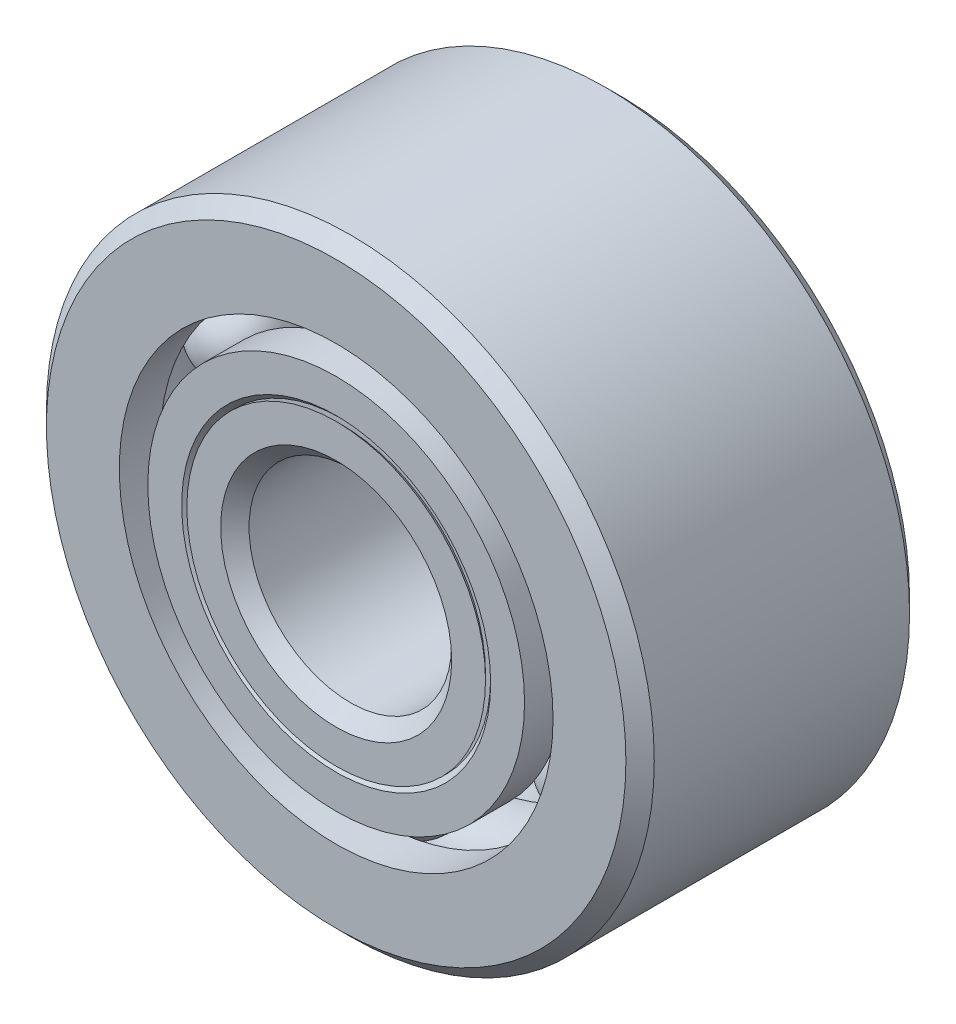
ISO-10303-21;
HEADER;
FILE_DESCRIPTION(('STEP AP214'),'2;1');
FILE_NAME('part.step','',(''),(''),'','','');
FILE_SCHEMA(('AUTOMOTIVE_DESIGN { 1 0 10303 214 1 1 1 1 }'));
ENDSEC;
DATA;
#1=APPLICATION_CONTEXT('core data for automotive mechanical design processes');
#2=APPLICATION_PROTOCOL_DEFINITION('international standard','automotive_design',2000,#1);
#3=PRODUCT_CONTEXT('',#1,'mechanical');
#4=PRODUCT('Part','Part','',(#3));
#5=PRODUCT_RELATED_PRODUCT_CATEGORY('part','',(#4));
#6=PRODUCT_DEFINITION_FORMATION('','',#4);
#7=PRODUCT_DEFINITION_CONTEXT('part definition',#1,'design');
#8=PRODUCT_DEFINITION('design','',#6,#7);
#9=PRODUCT_DEFINITION_SHAPE('','',#8);
#10=(LENGTH_UNIT() NAMED_UNIT(*) SI_UNIT(.MILLI.,.METRE.));
#11=(NAMED_UNIT(*) PLANE_ANGLE_UNIT() SI_UNIT($,.RADIAN.));
#12=(NAMED_UNIT(*) SI_UNIT($,.STERADIAN.) SOLID_ANGLE_UNIT());
#13=UNCERTAINTY_MEASURE_WITH_UNIT(LENGTH_MEASURE(1.E-05),#10,'distance_accuracy_value','');
#14=(GEOMETRIC_REPRESENTATION_CONTEXT(3) GLOBAL_UNCERTAINTY_ASSIGNED_CONTEXT((#13)) GLOBAL_UNIT_ASSIGNED_CONTEXT((#10,
#11,#12)) REPRESENTATION_CONTEXT('',''));
#15=CARTESIAN_POINT('',(0.,0.,0.));
#16=DIRECTION('',(0.,0.,1.));
#17=DIRECTION('',(1.,0.,0.));
#18=AXIS2_PLACEMENT_3D('',#15,#16,#17);
#19=CARTESIAN_POINT('',(-8.66025403784433,5.0000000000001,-3.));
#20=DIRECTION('',(0.,0.,1.));
#21=DIRECTION('',(-0.866025403784433,0.50000000000001,0.));
#22=AXIS2_PLACEMENT_3D('',#19,#20,#21);
#23=SPHERICAL_SURFACE('',#22,2.12005336085392);
#24=CARTESIAN_POINT('',(-8.66025403784433,5.0000000000001,-0.879946639146077));
#25=VERTEX_POINT('',#24);
#26=VERTEX_LOOP('',#25);
#27=FACE_BOUND('',#26,.T.);
#28=ADVANCED_FACE('F40',(#27),#23,.T.);
#29=CLOSED_SHELL('',(#28));
#30=MANIFOLD_SOLID_BREP('B2',#29);
#31=CARTESIAN_POINT('',(-8.66025403784443,-4.99999999999992,-3.));
#32=DIRECTION('',(0.,0.,1.));
#33=DIRECTION('',(-0.866025403784443,-0.499999999999992,0.));
#34=AXIS2_PLACEMENT_3D('',#31,#32,#33);
#35=SPHERICAL_SURFACE('',#34,2.12005336085392);
#36=CARTESIAN_POINT('',(-8.66025403784443,-4.99999999999992,-0.879946639146077));
#37=VERTEX_POINT('',#36);
#38=VERTEX_LOOP('',#37);
#39=FACE_BOUND('',#38,.T.);
#40=ADVANCED_FACE('F59',(#39),#35,.T.);
#41=CLOSED_SHELL('',(#40));
#42=MANIFOLD_SOLID_BREP('B6',#41);
#43=CARTESIAN_POINT('',(0.,-10.,-3.));
#44=DIRECTION('',(0.,0.,1.));
#45=DIRECTION('',(0.,-1.,0.));
#46=AXIS2_PLACEMENT_3D('',#43,#44,#45);
#47=SPHERICAL_SURFACE('',#46,2.12005336085392);
#48=CARTESIAN_POINT('',(0.,-10.,-0.879946639146077));
#49=VERTEX_POINT('',#48);
#50=VERTEX_LOOP('',#49);
#51=FACE_BOUND('',#50,.T.);
#52=ADVANCED_FACE('F78',(#51),#47,.T.);
#53=CLOSED_SHELL('',(#52));
#54=MANIFOLD_SOLID_BREP('B36',#53);
#55=CARTESIAN_POINT('',(8.66025403784437,-5.00000000000004,-3.));
#56=DIRECTION('',(0.,0.,1.));
#57=DIRECTION('',(0.866025403784436,-0.500000000000004,0.));
#58=AXIS2_PLACEMENT_3D('',#55,#56,#57);
#59=SPHERICAL_SURFACE('',#58,2.12005336085392);
#60=CARTESIAN_POINT('',(8.66025403784437,-5.00000000000004,-0.879946639146077));
#61=VERTEX_POINT('',#60);
#62=VERTEX_LOOP('',#61);
#63=FACE_BOUND('',#62,.T.);
#64=ADVANCED_FACE('F97',(#63),#59,.T.);
#65=CLOSED_SHELL('',(#64));
#66=MANIFOLD_SOLID_BREP('B55',#65);
#67=CARTESIAN_POINT('',(8.6602540378444,4.99999999999998,-3.));
#68=DIRECTION('',(0.,0.,1.));
#69=DIRECTION('',(0.86602540378444,0.499999999999998,0.));
#70=AXIS2_PLACEMENT_3D('',#67,#68,#69);
#71=SPHERICAL_SURFACE('',#70,2.12005336085392);
#72=CARTESIAN_POINT('',(8.6602540378444,4.99999999999998,-0.879946639146077));
#73=VERTEX_POINT('',#72);
#74=VERTEX_LOOP('',#73);
#75=FACE_BOUND('',#74,.T.);
#76=ADVANCED_FACE('F116',(#75),#71,.T.);
#77=CLOSED_SHELL('',(#76));
#78=MANIFOLD_SOLID_BREP('B74',#77);
#79=CARTESIAN_POINT('',(-8.66025403784433,5.0000000000001,3.));
#80=DIRECTION('',(0.,0.,1.));
#81=DIRECTION('',(-0.866025403784433,0.50000000000001,0.));
#82=AXIS2_PLACEMENT_3D('',#79,#80,#81);
#83=SPHERICAL_SURFACE('',#82,2.12005336085392);
#84=CARTESIAN_POINT('',(-8.66025403784433,5.0000000000001,5.12005336085392));
#85=VERTEX_POINT('',#84);
#86=VERTEX_LOOP('',#85);
#87=FACE_BOUND('',#86,.T.);
#88=ADVANCED_FACE('F135',(#87),#83,.T.);
#89=CLOSED_SHELL('',(#88));
#90=MANIFOLD_SOLID_BREP('B93',#89);
#91=CARTESIAN_POINT('',(-8.66025403784444,-4.99999999999992,3.));
#92=DIRECTION('',(0.,0.,1.));
#93=DIRECTION('',(-0.866025403784443,-0.499999999999992,0.));
#94=AXIS2_PLACEMENT_3D('',#91,#92,#93);
#95=SPHERICAL_SURFACE('',#94,2.12005336085392);
#96=CARTESIAN_POINT('',(-8.66025403784444,-4.99999999999992,5.12005336085392));
#97=VERTEX_POINT('',#96);
#98=VERTEX_LOOP('',#97);
#99=FACE_BOUND('',#98,.T.);
#100=ADVANCED_FACE('F154',(#99),#95,.T.);
#101=CLOSED_SHELL('',(#100));
#102=MANIFOLD_SOLID_BREP('B112',#101);
#103=CARTESIAN_POINT('',(0.,-10.,3.));
#104=DIRECTION('',(0.,0.,1.));
#105=DIRECTION('',(0.,-1.,0.));
#106=AXIS2_PLACEMENT_3D('',#103,#104,#105);
#107=SPHERICAL_SURFACE('',#106,2.12005336085392);
#108=CARTESIAN_POINT('',(0.,-10.,5.12005336085392));
#109=VERTEX_POINT('',#108);
#110=VERTEX_LOOP('',#109);
#111=FACE_BOUND('',#110,.T.);
#112=ADVANCED_FACE('F173',(#111),#107,.T.);
#113=CLOSED_SHELL('',(#112));
#114=MANIFOLD_SOLID_BREP('B131',#113);
#115=CARTESIAN_POINT('',(8.66025403784437,-5.00000000000004,3.));
#116=DIRECTION('',(0.,0.,1.));
#117=DIRECTION('',(0.866025403784436,-0.500000000000004,0.));
#118=AXIS2_PLACEMENT_3D('',#115,#116,#117);
#119=SPHERICAL_SURFACE('',#118,2.12005336085392);
#120=CARTESIAN_POINT('',(8.66025403784437,-5.00000000000004,5.12005336085392));
#121=VERTEX_POINT('',#120);
#122=VERTEX_LOOP('',#121);
#123=FACE_BOUND('',#122,.T.);
#124=ADVANCED_FACE('F192',(#123),#119,.T.);
#125=CLOSED_SHELL('',(#124));
#126=MANIFOLD_SOLID_BREP('B150',#125);
#127=CARTESIAN_POINT('',(8.6602540378444,4.99999999999998,3.));
#128=DIRECTION('',(0.,0.,1.));
#129=DIRECTION('',(0.86602540378444,0.499999999999998,0.));
#130=AXIS2_PLACEMENT_3D('',#127,#128,#129);
#131=SPHERICAL_SURFACE('',#130,2.12005336085392);
#132=CARTESIAN_POINT('',(8.6602540378444,4.99999999999998,5.12005336085392));
#133=VERTEX_POINT('',#132);
#134=VERTEX_LOOP('',#133);
#135=FACE_BOUND('',#134,.T.);
#136=ADVANCED_FACE('F211',(#135),#131,.T.);
#137=CLOSED_SHELL('',(#136));
#138=MANIFOLD_SOLID_BREP('B169',#137);
#139=CARTESIAN_POINT('',(0.,10.,-3.));
#140=DIRECTION('',(0.,0.,1.));
#141=DIRECTION('',(0.,1.,0.));
#142=AXIS2_PLACEMENT_3D('',#139,#140,#141);
#143=SPHERICAL_SURFACE('',#142,2.12005336085392);
#144=CARTESIAN_POINT('',(0.,10.,-0.879946639146077));
#145=VERTEX_POINT('',#144);
#146=VERTEX_LOOP('',#145);
#147=FACE_BOUND('',#146,.T.);
#148=ADVANCED_FACE('F230',(#147),#143,.T.);
#149=CLOSED_SHELL('',(#148));
#150=MANIFOLD_SOLID_BREP('B188',#149);
#151=CARTESIAN_POINT('',(0.,10.,3.));
#152=DIRECTION('',(0.,0.,1.));
#153=DIRECTION('',(0.,1.,0.));
#154=AXIS2_PLACEMENT_3D('',#151,#152,#153);
#155=SPHERICAL_SURFACE('',#154,2.12005336085392);
#156=CARTESIAN_POINT('',(0.,10.,5.12005336085392));
#157=VERTEX_POINT('',#156);
#158=VERTEX_LOOP('',#157);
#159=FACE_BOUND('',#158,.T.);
#160=ADVANCED_FACE('F251',(#159),#155,.T.);
#161=CLOSED_SHELL('',(#160));
#162=MANIFOLD_SOLID_BREP('B207',#161);
#163=CARTESIAN_POINT('',(0.,9.2967032967033,7.));
#164=DIRECTION('',(0.,0.,-1.));
#165=DIRECTION('',(-1.,0.,0.));
#166=AXIS2_PLACEMENT_3D('',#163,#164,#165);
#167=PLANE('',#166);
#168=CARTESIAN_POINT('',(0.,0.,7.));
#169=DIRECTION('',(0.,0.,1.));
#170=DIRECTION('',(1.,0.,0.));
#171=AXIS2_PLACEMENT_3D('',#168,#169,#170);
#172=CIRCLE('',#171,7.62535164835165);
#173=CARTESIAN_POINT('',(7.62535164835165,0.,7.));
#174=VERTEX_POINT('',#173);
#175=EDGE_CURVE('E250',#174,#174,#172,.T.);
#176=ORIENTED_EDGE('',*,*,#175,.F.);
#177=EDGE_LOOP('',(#176));
#178=FACE_BOUND('',#177,.T.);
#179=CARTESIAN_POINT('',(0.,0.,7.));
#180=DIRECTION('',(0.,0.,1.));
#181=DIRECTION('',(1.,0.,0.));
#182=AXIS2_PLACEMENT_3D('',#179,#180,#181);
#183=CIRCLE('',#182,9.2967032967033);
#184=CARTESIAN_POINT('',(9.2967032967033,0.,7.));
#185=VERTEX_POINT('',#184);
#186=EDGE_CURVE('E317',#185,#185,#183,.T.);
#187=ORIENTED_EDGE('',*,*,#186,.T.);
#188=EDGE_LOOP('',(#187));
#189=FACE_BOUND('',#188,.T.);
#190=ADVANCED_FACE('F271',(#178,#189),#167,.F.);
#191=CARTESIAN_POINT('',(0.,0.,7.));
#192=DIRECTION('',(0.,0.,1.));
#193=DIRECTION('',(1.,0.,0.));
#194=AXIS2_PLACEMENT_3D('',#191,#192,#193);
#195=CONICAL_SURFACE('',#194,7.62535164835165,0.785398163397447);
#196=CARTESIAN_POINT('',(0.,0.,6.746));
#197=DIRECTION('',(0.,0.,1.));
#198=DIRECTION('',(1.,0.,0.));
#199=AXIS2_PLACEMENT_3D('',#196,#197,#198);
#200=CIRCLE('',#199,7.37135164835165);
#201=CARTESIAN_POINT('',(7.37135164835165,0.,6.746));
#202=VERTEX_POINT('',#201);
#203=EDGE_CURVE('E277',#202,#202,#200,.T.);
#204=ORIENTED_EDGE('',*,*,#203,.F.);
#205=EDGE_LOOP('',(#204));
#206=FACE_BOUND('',#205,.T.);
#207=ORIENTED_EDGE('',*,*,#175,.T.);
#208=EDGE_LOOP('',(#207));
#209=FACE_BOUND('',#208,.T.);
#210=ADVANCED_FACE('F390',(#206,#209),#195,.F.);
#211=CARTESIAN_POINT('',(0.,7.11735164835165,6.746));
#212=DIRECTION('',(0.,0.,-1.));
#213=DIRECTION('',(-1.,0.,0.));
#214=AXIS2_PLACEMENT_3D('',#211,#212,#213);
#215=PLANE('',#214);
#216=CARTESIAN_POINT('',(0.,0.,6.746));
#217=DIRECTION('',(0.,0.,1.));
#218=DIRECTION('',(1.,0.,0.));
#219=AXIS2_PLACEMENT_3D('',#216,#217,#218);
#220=CIRCLE('',#219,7.11735164835165);
#221=CARTESIAN_POINT('',(7.11735164835165,0.,6.746));
#222=VERTEX_POINT('',#221);
#223=EDGE_CURVE('E281',#222,#222,#220,.T.);
#224=ORIENTED_EDGE('',*,*,#223,.F.);
#225=EDGE_LOOP('',(#224));
#226=FACE_BOUND('',#225,.T.);
#227=ORIENTED_EDGE('',*,*,#203,.T.);
#228=EDGE_LOOP('',(#227));
#229=FACE_BOUND('',#228,.T.);
#230=ADVANCED_FACE('F385',(#226,#229),#215,.F.);
#231=CARTESIAN_POINT('',(0.,0.,6.746));
#232=DIRECTION('',(0.,0.,1.));
#233=DIRECTION('',(1.,0.,0.));
#234=AXIS2_PLACEMENT_3D('',#231,#232,#233);
#235=CONICAL_SURFACE('',#234,7.11735164835165,0.785398163397442);
#236=CARTESIAN_POINT('',(0.,0.,7.));
#237=DIRECTION('',(0.,0.,1.));
#238=DIRECTION('',(1.,0.,0.));
#239=AXIS2_PLACEMENT_3D('',#236,#237,#238);
#240=CIRCLE('',#239,7.37135164835165);
#241=CARTESIAN_POINT('',(7.37135164835165,0.,7.));
#242=VERTEX_POINT('',#241);
#243=EDGE_CURVE('E285',#242,#242,#240,.T.);
#244=ORIENTED_EDGE('',*,*,#243,.F.);
#245=EDGE_LOOP('',(#244));
#246=FACE_BOUND('',#245,.T.);
#247=ORIENTED_EDGE('',*,*,#223,.T.);
#248=EDGE_LOOP('',(#247));
#249=FACE_BOUND('',#248,.T.);
#250=ADVANCED_FACE('F379',(#246,#249),#235,.T.);
#251=CARTESIAN_POINT('',(0.,7.37135164835165,7.));
#252=DIRECTION('',(0.,0.,-1.));
#253=DIRECTION('',(-1.,0.,0.));
#254=AXIS2_PLACEMENT_3D('',#251,#252,#253);
#255=PLANE('',#254);
#256=CARTESIAN_POINT('',(0.,0.,7.));
#257=DIRECTION('',(0.,0.,1.));
#258=DIRECTION('',(1.,0.,0.));
#259=AXIS2_PLACEMENT_3D('',#256,#257,#258);
#260=CIRCLE('',#259,5.7);
#261=CARTESIAN_POINT('',(5.7,0.,7.));
#262=VERTEX_POINT('',#261);
#263=EDGE_CURVE('E290',#262,#262,#260,.T.);
#264=ORIENTED_EDGE('',*,*,#263,.F.);
#265=EDGE_LOOP('',(#264));
#266=FACE_BOUND('',#265,.T.);
#267=ORIENTED_EDGE('',*,*,#243,.T.);
#268=EDGE_LOOP('',(#267));
#269=FACE_BOUND('',#268,.T.);
#270=ADVANCED_FACE('F373',(#266,#269),#255,.F.);
#271=CARTESIAN_POINT('',(0.,0.,7.));
#272=DIRECTION('',(0.,0.,1.));
#273=DIRECTION('',(1.,0.,0.));
#274=AXIS2_PLACEMENT_3D('',#271,#272,#273);
#275=CONICAL_SURFACE('',#274,5.7,0.785398163397447);
#276=CARTESIAN_POINT('',(0.,0.,6.3));
#277=DIRECTION('',(0.,0.,1.));
#278=DIRECTION('',(1.,0.,0.));
#279=AXIS2_PLACEMENT_3D('',#276,#277,#278);
#280=CIRCLE('',#279,5.);
#281=CARTESIAN_POINT('',(5.,0.,6.3));
#282=VERTEX_POINT('',#281);
#283=EDGE_CURVE('E293',#282,#282,#280,.T.);
#284=ORIENTED_EDGE('',*,*,#283,.F.);
#285=EDGE_LOOP('',(#284));
#286=FACE_BOUND('',#285,.T.);
#287=ORIENTED_EDGE('',*,*,#263,.T.);
#288=EDGE_LOOP('',(#287));
#289=FACE_BOUND('',#288,.T.);
#290=ADVANCED_FACE('F367',(#286,#289),#275,.F.);
#291=CARTESIAN_POINT('',(0.,0.,7.));
#292=DIRECTION('',(0.,0.,1.));
#293=DIRECTION('',(1.,0.,0.));
#294=AXIS2_PLACEMENT_3D('',#291,#292,#293);
#295=CYLINDRICAL_SURFACE('',#294,5.);
#296=CARTESIAN_POINT('',(0.,0.,-6.3));
#297=DIRECTION('',(0.,0.,1.));
#298=DIRECTION('',(1.,0.,0.));
#299=AXIS2_PLACEMENT_3D('',#296,#297,#298);
#300=CIRCLE('',#299,5.);
#301=CARTESIAN_POINT('',(5.,0.,-6.3));
#302=VERTEX_POINT('',#301);
#303=EDGE_CURVE('E296',#302,#302,#300,.T.);
#304=ORIENTED_EDGE('',*,*,#303,.F.);
#305=EDGE_LOOP('',(#304));
#306=FACE_BOUND('',#305,.T.);
#307=ORIENTED_EDGE('',*,*,#283,.T.);
#308=EDGE_LOOP('',(#307));
#309=FACE_BOUND('',#308,.T.);
#310=ADVANCED_FACE('F361',(#306,#309),#295,.F.);
#311=CARTESIAN_POINT('',(0.,0.,-6.3));
#312=DIRECTION('',(0.,0.,-1.));
#313=DIRECTION('',(-1.,0.,0.));
#314=AXIS2_PLACEMENT_3D('',#311,#312,#313);
#315=CONICAL_SURFACE('',#314,5.,0.785398163397446);
#316=CARTESIAN_POINT('',(0.,0.,-7.));
#317=DIRECTION('',(0.,0.,1.));
#318=DIRECTION('',(1.,0.,0.));
#319=AXIS2_PLACEMENT_3D('',#316,#317,#318);
#320=CIRCLE('',#319,5.7);
#321=CARTESIAN_POINT('',(5.7,0.,-7.));
#322=VERTEX_POINT('',#321);
#323=EDGE_CURVE('E299',#322,#322,#320,.T.);
#324=ORIENTED_EDGE('',*,*,#323,.F.);
#325=EDGE_LOOP('',(#324));
#326=FACE_BOUND('',#325,.T.);
#327=ORIENTED_EDGE('',*,*,#303,.T.);
#328=EDGE_LOOP('',(#327));
#329=FACE_BOUND('',#328,.T.);
#330=ADVANCED_FACE('F355',(#326,#329),#315,.F.);
#331=CARTESIAN_POINT('',(0.,9.2967032967033,-7.));
#332=DIRECTION('',(0.,0.,1.));
#333=DIRECTION('',(1.,0.,0.));
#334=AXIS2_PLACEMENT_3D('',#331,#332,#333);
#335=PLANE('',#334);
#336=CARTESIAN_POINT('',(0.,0.,-7.00000000000001));
#337=DIRECTION('',(0.,0.,1.));
#338=DIRECTION('',(1.,0.,0.));
#339=AXIS2_PLACEMENT_3D('',#336,#337,#338);
#340=CIRCLE('',#339,9.2967032967033);
#341=CARTESIAN_POINT('',(9.2967032967033,0.,-7.00000000000001));
#342=VERTEX_POINT('',#341);
#343=EDGE_CURVE('E302',#342,#342,#340,.T.);
#344=ORIENTED_EDGE('',*,*,#343,.F.);
#345=EDGE_LOOP('',(#344));
#346=FACE_BOUND('',#345,.T.);
#347=ORIENTED_EDGE('',*,*,#323,.T.);
#348=EDGE_LOOP('',(#347));
#349=FACE_BOUND('',#348,.T.);
#350=ADVANCED_FACE('F349',(#346,#349),#335,.F.);
#351=CARTESIAN_POINT('',(0.,0.,7.));
#352=DIRECTION('',(0.,0.,1.));
#353=DIRECTION('',(1.,0.,0.));
#354=AXIS2_PLACEMENT_3D('',#351,#352,#353);
#355=CYLINDRICAL_SURFACE('',#354,9.2967032967033);
#356=CARTESIAN_POINT('',(0.,0.,-5.));
#357=DIRECTION('',(0.,0.,1.));
#358=DIRECTION('',(1.,0.,0.));
#359=AXIS2_PLACEMENT_3D('',#356,#357,#358);
#360=CIRCLE('',#359,9.2967032967033);
#361=CARTESIAN_POINT('',(9.2967032967033,0.,-5.));
#362=VERTEX_POINT('',#361);
#363=EDGE_CURVE('E305',#362,#362,#360,.T.);
#364=ORIENTED_EDGE('',*,*,#363,.F.);
#365=EDGE_LOOP('',(#364));
#366=FACE_BOUND('',#365,.T.);
#367=ORIENTED_EDGE('',*,*,#343,.T.);
#368=EDGE_LOOP('',(#367));
#369=FACE_BOUND('',#368,.T.);
#370=ADVANCED_FACE('F343',(#366,#369),#355,.T.);
#371=CARTESIAN_POINT('',(0.,0.,-3.));
#372=DIRECTION('',(0.,0.,1.));
#373=DIRECTION('',(1.,0.,0.));
#374=AXIS2_PLACEMENT_3D('',#371,#372,#373);
#375=TOROIDAL_SURFACE('',#374,10.,2.12005336085392);
#376=CARTESIAN_POINT('',(0.,0.,-0.999999999999997));
#377=DIRECTION('',(0.,0.,1.));
#378=DIRECTION('',(1.,0.,0.));
#379=AXIS2_PLACEMENT_3D('',#376,#377,#378);
#380=CIRCLE('',#379,9.2967032967033);
#381=CARTESIAN_POINT('',(9.2967032967033,0.,-0.999999999999997));
#382=VERTEX_POINT('',#381);
#383=EDGE_CURVE('E308',#382,#382,#380,.T.);
#384=ORIENTED_EDGE('',*,*,#383,.F.);
#385=EDGE_LOOP('',(#384));
#386=FACE_BOUND('',#385,.T.);
#387=ORIENTED_EDGE('',*,*,#363,.T.);
#388=EDGE_LOOP('',(#387));
#389=FACE_BOUND('',#388,.T.);
#390=ADVANCED_FACE('F337',(#386,#389),#375,.F.);
#391=CARTESIAN_POINT('',(0.,0.,7.));
#392=DIRECTION('',(0.,0.,1.));
#393=DIRECTION('',(1.,0.,0.));
#394=AXIS2_PLACEMENT_3D('',#391,#392,#393);
#395=CYLINDRICAL_SURFACE('',#394,9.2967032967033);
#396=CARTESIAN_POINT('',(0.,0.,1.));
#397=DIRECTION('',(0.,0.,1.));
#398=DIRECTION('',(1.,0.,0.));
#399=AXIS2_PLACEMENT_3D('',#396,#397,#398);
#400=CIRCLE('',#399,9.2967032967033);
#401=CARTESIAN_POINT('',(9.2967032967033,0.,1.));
#402=VERTEX_POINT('',#401);
#403=EDGE_CURVE('E311',#402,#402,#400,.T.);
#404=ORIENTED_EDGE('',*,*,#403,.F.);
#405=EDGE_LOOP('',(#404));
#406=FACE_BOUND('',#405,.T.);
#407=ORIENTED_EDGE('',*,*,#383,.T.);
#408=EDGE_LOOP('',(#407));
#409=FACE_BOUND('',#408,.T.);
#410=ADVANCED_FACE('F331',(#406,#409),#395,.T.);
#411=CARTESIAN_POINT('',(0.,0.,3.));
#412=DIRECTION('',(0.,0.,1.));
#413=DIRECTION('',(1.,0.,0.));
#414=AXIS2_PLACEMENT_3D('',#411,#412,#413);
#415=TOROIDAL_SURFACE('',#414,10.,2.12005336085392);
#416=CARTESIAN_POINT('',(0.,0.,5.));
#417=DIRECTION('',(0.,0.,1.));
#418=DIRECTION('',(1.,0.,0.));
#419=AXIS2_PLACEMENT_3D('',#416,#417,#418);
#420=CIRCLE('',#419,9.2967032967033);
#421=CARTESIAN_POINT('',(9.2967032967033,0.,5.));
#422=VERTEX_POINT('',#421);
#423=EDGE_CURVE('E314',#422,#422,#420,.T.);
#424=ORIENTED_EDGE('',*,*,#423,.F.);
#425=EDGE_LOOP('',(#424));
#426=FACE_BOUND('',#425,.T.);
#427=ORIENTED_EDGE('',*,*,#403,.T.);
#428=EDGE_LOOP('',(#427));
#429=FACE_BOUND('',#428,.T.);
#430=ADVANCED_FACE('F325',(#426,#429),#415,.F.);
#431=CARTESIAN_POINT('',(0.,0.,7.));
#432=DIRECTION('',(0.,0.,1.));
#433=DIRECTION('',(1.,0.,0.));
#434=AXIS2_PLACEMENT_3D('',#431,#432,#433);
#435=CYLINDRICAL_SURFACE('',#434,9.2967032967033);
#436=ORIENTED_EDGE('',*,*,#186,.F.);
#437=EDGE_LOOP('',(#436));
#438=FACE_BOUND('',#437,.T.);
#439=ORIENTED_EDGE('',*,*,#423,.T.);
#440=EDGE_LOOP('',(#439));
#441=FACE_BOUND('',#440,.T.);
#442=ADVANCED_FACE('F322',(#438,#441),#435,.T.);
#443=CLOSED_SHELL('',(#190,#210,#230,#250,#270,#290,#310,#330,#350,#370,#390,#410,#430,#442));
#444=MANIFOLD_SOLID_BREP('B226',#443);
#445=CARTESIAN_POINT('',(0.,0.,6.3));
#446=DIRECTION('',(0.,0.,-1.));
#447=DIRECTION('',(-1.,0.,0.));
#448=AXIS2_PLACEMENT_3D('',#445,#446,#447);
#449=CONICAL_SURFACE('',#448,15.,0.785398163397447);
#450=CARTESIAN_POINT('',(0.,0.,7.));
#451=DIRECTION('',(0.,0.,1.));
#452=DIRECTION('',(1.,0.,0.));
#453=AXIS2_PLACEMENT_3D('',#450,#451,#452);
#454=CIRCLE('',#453,14.3);
#455=CARTESIAN_POINT('',(14.3,0.,7.));
#456=VERTEX_POINT('',#455);
#457=EDGE_CURVE('E517',#456,#456,#454,.T.);
#458=ORIENTED_EDGE('',*,*,#457,.F.);
#459=EDGE_LOOP('',(#458));
#460=FACE_BOUND('',#459,.T.);
#461=CARTESIAN_POINT('',(0.,0.,6.3));
#462=DIRECTION('',(0.,0.,1.));
#463=DIRECTION('',(1.,0.,0.));
#464=AXIS2_PLACEMENT_3D('',#461,#462,#463);
#465=CIRCLE('',#464,15.);
#466=CARTESIAN_POINT('',(15.,0.,6.3));
#467=VERTEX_POINT('',#466);
#468=EDGE_CURVE('E270',#467,#467,#465,.T.);
#469=ORIENTED_EDGE('',*,*,#468,.T.);
#470=EDGE_LOOP('',(#469));
#471=FACE_BOUND('',#470,.T.);
#472=ADVANCED_FACE('F483',(#460,#471),#449,.T.);
#473=CARTESIAN_POINT('',(0.,0.,7.));
#474=DIRECTION('',(0.,0.,1.));
#475=DIRECTION('',(1.,0.,0.));
#476=AXIS2_PLACEMENT_3D('',#473,#474,#475);
#477=CYLINDRICAL_SURFACE('',#476,15.);
#478=ORIENTED_EDGE('',*,*,#468,.F.);
#479=EDGE_LOOP('',(#478));
#480=FACE_BOUND('',#479,.T.);
#481=CARTESIAN_POINT('',(0.,0.,-6.3));
#482=DIRECTION('',(0.,0.,1.));
#483=DIRECTION('',(1.,0.,0.));
#484=AXIS2_PLACEMENT_3D('',#481,#482,#483);
#485=CIRCLE('',#484,15.);
#486=CARTESIAN_POINT('',(15.,0.,-6.3));
#487=VERTEX_POINT('',#486);
#488=EDGE_CURVE('E489',#487,#487,#485,.T.);
#489=ORIENTED_EDGE('',*,*,#488,.T.);
#490=EDGE_LOOP('',(#489));
#491=FACE_BOUND('',#490,.T.);
#492=ADVANCED_FACE('F524',(#480,#491),#477,.T.);
#493=CARTESIAN_POINT('',(0.,0.,-7.));
#494=DIRECTION('',(0.,0.,1.));
#495=DIRECTION('',(1.,0.,0.));
#496=AXIS2_PLACEMENT_3D('',#493,#494,#495);
#497=CONICAL_SURFACE('',#496,14.3,0.785398163397445);
#498=ORIENTED_EDGE('',*,*,#488,.F.);
#499=EDGE_LOOP('',(#498));
#500=FACE_BOUND('',#499,.T.);
#501=CARTESIAN_POINT('',(0.,0.,-7.));
#502=DIRECTION('',(0.,0.,1.));
#503=DIRECTION('',(1.,0.,0.));
#504=AXIS2_PLACEMENT_3D('',#501,#502,#503);
#505=CIRCLE('',#504,14.3);
#506=CARTESIAN_POINT('',(14.3,0.,-7.));
#507=VERTEX_POINT('',#506);
#508=EDGE_CURVE('E493',#507,#507,#505,.T.);
#509=ORIENTED_EDGE('',*,*,#508,.T.);
#510=EDGE_LOOP('',(#509));
#511=FACE_BOUND('',#510,.T.);
#512=ADVANCED_FACE('F528',(#500,#511),#497,.T.);
#513=CARTESIAN_POINT('',(0.,14.3,-7.));
#514=DIRECTION('',(0.,0.,1.));
#515=DIRECTION('',(1.,0.,0.));
#516=AXIS2_PLACEMENT_3D('',#513,#514,#515);
#517=PLANE('',#516);
#518=ORIENTED_EDGE('',*,*,#508,.F.);
#519=EDGE_LOOP('',(#518));
#520=FACE_BOUND('',#519,.T.);
#521=CARTESIAN_POINT('',(0.,0.,-7.));
#522=DIRECTION('',(0.,0.,1.));
#523=DIRECTION('',(1.,0.,0.));
#524=AXIS2_PLACEMENT_3D('',#521,#522,#523);
#525=CIRCLE('',#524,10.7032967032967);
#526=CARTESIAN_POINT('',(10.7032967032967,0.,-7.));
#527=VERTEX_POINT('',#526);
#528=EDGE_CURVE('E497',#527,#527,#525,.T.);
#529=ORIENTED_EDGE('',*,*,#528,.T.);
#530=EDGE_LOOP('',(#529));
#531=FACE_BOUND('',#530,.T.);
#532=ADVANCED_FACE('F533',(#520,#531),#517,.F.);
#533=CARTESIAN_POINT('',(0.,0.,7.));
#534=DIRECTION('',(0.,0.,1.));
#535=DIRECTION('',(1.,0.,0.));
#536=AXIS2_PLACEMENT_3D('',#533,#534,#535);
#537=CYLINDRICAL_SURFACE('',#536,10.7032967032967);
#538=ORIENTED_EDGE('',*,*,#528,.F.);
#539=EDGE_LOOP('',(#538));
#540=FACE_BOUND('',#539,.T.);
#541=CARTESIAN_POINT('',(0.,0.,-5.));
#542=DIRECTION('',(0.,0.,1.));
#543=DIRECTION('',(1.,0.,0.));
#544=AXIS2_PLACEMENT_3D('',#541,#542,#543);
#545=CIRCLE('',#544,10.7032967032967);
#546=CARTESIAN_POINT('',(10.7032967032967,0.,-5.));
#547=VERTEX_POINT('',#546);
#548=EDGE_CURVE('E502',#547,#547,#545,.T.);
#549=ORIENTED_EDGE('',*,*,#548,.T.);
#550=EDGE_LOOP('',(#549));
#551=FACE_BOUND('',#550,.T.);
#552=ADVANCED_FACE('F539',(#540,#551),#537,.F.);
#553=CARTESIAN_POINT('',(0.,0.,-3.));
#554=DIRECTION('',(0.,0.,1.));
#555=DIRECTION('',(1.,0.,0.));
#556=AXIS2_PLACEMENT_3D('',#553,#554,#555);
#557=TOROIDAL_SURFACE('',#556,10.,2.12005336085392);
#558=ORIENTED_EDGE('',*,*,#548,.F.);
#559=EDGE_LOOP('',(#558));
#560=FACE_BOUND('',#559,.T.);
#561=CARTESIAN_POINT('',(0.,0.,-1.));
#562=DIRECTION('',(0.,0.,1.));
#563=DIRECTION('',(1.,0.,0.));
#564=AXIS2_PLACEMENT_3D('',#561,#562,#563);
#565=CIRCLE('',#564,10.7032967032967);
#566=CARTESIAN_POINT('',(10.7032967032967,0.,-1.));
#567=VERTEX_POINT('',#566);
#568=EDGE_CURVE('E505',#567,#567,#565,.T.);
#569=ORIENTED_EDGE('',*,*,#568,.T.);
#570=EDGE_LOOP('',(#569));
#571=FACE_BOUND('',#570,.T.);
#572=ADVANCED_FACE('F543',(#560,#571),#557,.F.);
#573=CARTESIAN_POINT('',(0.,0.,7.));
#574=DIRECTION('',(0.,0.,1.));
#575=DIRECTION('',(1.,0.,0.));
#576=AXIS2_PLACEMENT_3D('',#573,#574,#575);
#577=CYLINDRICAL_SURFACE('',#576,10.7032967032967);
#578=ORIENTED_EDGE('',*,*,#568,.F.);
#579=EDGE_LOOP('',(#578));
#580=FACE_BOUND('',#579,.T.);
#581=CARTESIAN_POINT('',(0.,0.,1.));
#582=DIRECTION('',(0.,0.,1.));
#583=DIRECTION('',(1.,0.,0.));
#584=AXIS2_PLACEMENT_3D('',#581,#582,#583);
#585=CIRCLE('',#584,10.7032967032967);
#586=CARTESIAN_POINT('',(10.7032967032967,0.,1.));
#587=VERTEX_POINT('',#586);
#588=EDGE_CURVE('E508',#587,#587,#585,.T.);
#589=ORIENTED_EDGE('',*,*,#588,.T.);
#590=EDGE_LOOP('',(#589));
#591=FACE_BOUND('',#590,.T.);
#592=ADVANCED_FACE('F547',(#580,#591),#577,.F.);
#593=CARTESIAN_POINT('',(0.,0.,3.));
#594=DIRECTION('',(0.,0.,1.));
#595=DIRECTION('',(1.,0.,0.));
#596=AXIS2_PLACEMENT_3D('',#593,#594,#595);
#597=TOROIDAL_SURFACE('',#596,10.,2.12005336085392);
#598=ORIENTED_EDGE('',*,*,#588,.F.);
#599=EDGE_LOOP('',(#598));
#600=FACE_BOUND('',#599,.T.);
#601=CARTESIAN_POINT('',(0.,0.,5.));
#602=DIRECTION('',(0.,0.,1.));
#603=DIRECTION('',(1.,0.,0.));
#604=AXIS2_PLACEMENT_3D('',#601,#602,#603);
#605=CIRCLE('',#604,10.7032967032967);
#606=CARTESIAN_POINT('',(10.7032967032967,0.,5.));
#607=VERTEX_POINT('',#606);
#608=EDGE_CURVE('E511',#607,#607,#605,.T.);
#609=ORIENTED_EDGE('',*,*,#608,.T.);
#610=EDGE_LOOP('',(#609));
#611=FACE_BOUND('',#610,.T.);
#612=ADVANCED_FACE('F551',(#600,#611),#597,.F.);
#613=CARTESIAN_POINT('',(0.,0.,7.));
#614=DIRECTION('',(0.,0.,1.));
#615=DIRECTION('',(1.,0.,0.));
#616=AXIS2_PLACEMENT_3D('',#613,#614,#615);
#617=CYLINDRICAL_SURFACE('',#616,10.7032967032967);
#618=ORIENTED_EDGE('',*,*,#608,.F.);
#619=EDGE_LOOP('',(#618));
#620=FACE_BOUND('',#619,.T.);
#621=CARTESIAN_POINT('',(0.,0.,7.));
#622=DIRECTION('',(0.,0.,1.));
#623=DIRECTION('',(1.,0.,0.));
#624=AXIS2_PLACEMENT_3D('',#621,#622,#623);
#625=CIRCLE('',#624,10.7032967032967);
#626=CARTESIAN_POINT('',(10.7032967032967,0.,7.));
#627=VERTEX_POINT('',#626);
#628=EDGE_CURVE('E514',#627,#627,#625,.T.);
#629=ORIENTED_EDGE('',*,*,#628,.T.);
#630=EDGE_LOOP('',(#629));
#631=FACE_BOUND('',#630,.T.);
#632=ADVANCED_FACE('F555',(#620,#631),#617,.F.);
#633=CARTESIAN_POINT('',(0.,14.3,7.));
#634=DIRECTION('',(0.,0.,-1.));
#635=DIRECTION('',(-1.,0.,0.));
#636=AXIS2_PLACEMENT_3D('',#633,#634,#635);
#637=PLANE('',#636);
#638=ORIENTED_EDGE('',*,*,#628,.F.);
#639=EDGE_LOOP('',(#638));
#640=FACE_BOUND('',#639,.T.);
#641=ORIENTED_EDGE('',*,*,#457,.T.);
#642=EDGE_LOOP('',(#641));
#643=FACE_BOUND('',#642,.T.);
#644=ADVANCED_FACE('F521',(#640,#643),#637,.F.);
#645=CLOSED_SHELL('',(#472,#492,#512,#532,#552,#572,#592,#612,#632,#644));
#646=MANIFOLD_SOLID_BREP('B245',#645);
#647=ADVANCED_BREP_SHAPE_REPRESENTATION('',(#18,#30,#42,#54,#66,#78,#90,#102,#114,#126,#138,
#150,#162,#444,#646),#14);
#648=SHAPE_DEFINITION_REPRESENTATION(#9,#647);
ENDSEC;
END-ISO-10303-21;
